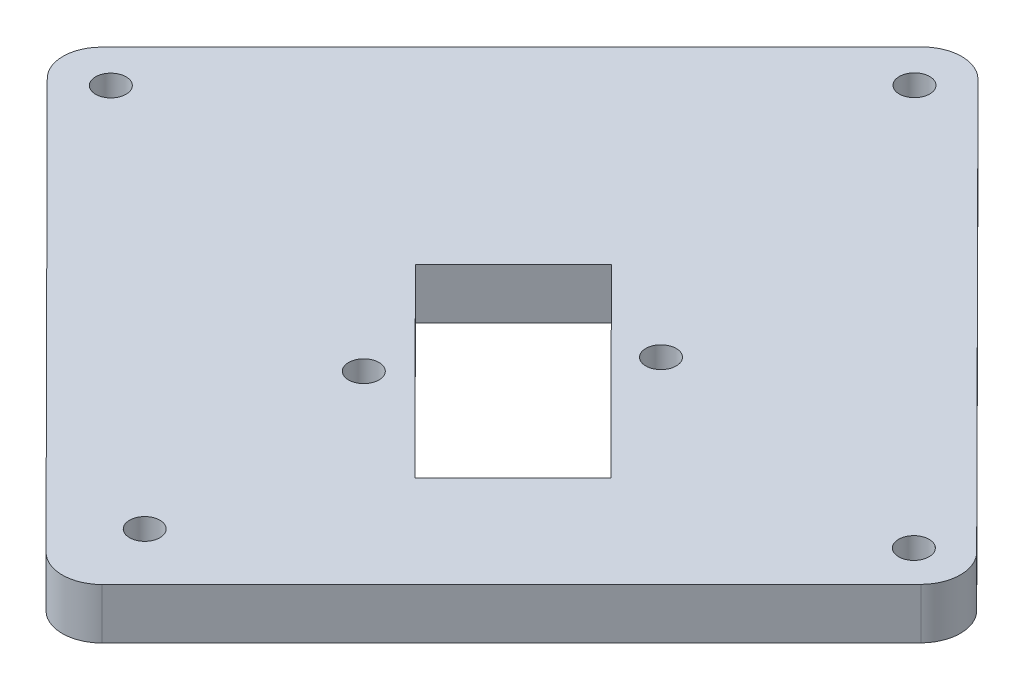
ISO-10303-21;
HEADER;
FILE_DESCRIPTION(('STEP AP214'),'2;1');
FILE_NAME('part.step','',(''),(''),'','','');
FILE_SCHEMA(('AUTOMOTIVE_DESIGN { 1 0 10303 214 1 1 1 1 }'));
ENDSEC;
DATA;
#1=APPLICATION_CONTEXT('core data for automotive mechanical design processes');
#2=APPLICATION_PROTOCOL_DEFINITION('international standard','automotive_design',2000,#1);
#3=PRODUCT_CONTEXT('',#1,'mechanical');
#4=PRODUCT('Part','Part','',(#3));
#5=PRODUCT_RELATED_PRODUCT_CATEGORY('part','',(#4));
#6=PRODUCT_DEFINITION_FORMATION('','',#4);
#7=PRODUCT_DEFINITION_CONTEXT('part definition',#1,'design');
#8=PRODUCT_DEFINITION('design','',#6,#7);
#9=PRODUCT_DEFINITION_SHAPE('','',#8);
#10=(LENGTH_UNIT() NAMED_UNIT(*) SI_UNIT(.MILLI.,.METRE.));
#11=(NAMED_UNIT(*) PLANE_ANGLE_UNIT() SI_UNIT($,.RADIAN.));
#12=(NAMED_UNIT(*) SI_UNIT($,.STERADIAN.) SOLID_ANGLE_UNIT());
#13=UNCERTAINTY_MEASURE_WITH_UNIT(LENGTH_MEASURE(1.E-05),#10,'distance_accuracy_value','');
#14=(GEOMETRIC_REPRESENTATION_CONTEXT(3) GLOBAL_UNCERTAINTY_ASSIGNED_CONTEXT((#13)) GLOBAL_UNIT_ASSIGNED_CONTEXT((#10,
#11,#12)) REPRESENTATION_CONTEXT('',''));
#15=CARTESIAN_POINT('',(0.,0.,0.));
#16=DIRECTION('',(0.,0.,1.));
#17=DIRECTION('',(1.,0.,0.));
#18=AXIS2_PLACEMENT_3D('',#15,#16,#17);
#19=CARTESIAN_POINT('',(-23.1718112798814,3.175,-2.50689147833128));
#20=DIRECTION('',(0.,1.,0.));
#21=DIRECTION('',(0.,0.,1.));
#22=AXIS2_PLACEMENT_3D('',#19,#20,#21);
#23=PLANE('',#22);
#24=CARTESIAN_POINT('',(2.63009312960293,3.175,20.5685466159634));
#25=DIRECTION('',(0.,1.,0.));
#26=DIRECTION('',(0.,0.,1.));
#27=AXIS2_PLACEMENT_3D('',#24,#25,#26);
#28=CIRCLE('',#27,0.9525);
#29=CARTESIAN_POINT('',(2.63009312960293,3.175,21.5210466159634));
#30=VERTEX_POINT('',#29);
#31=EDGE_CURVE('E347',#30,#30,#28,.T.);
#32=ORIENTED_EDGE('',*,*,#31,.F.);
#33=EDGE_LOOP('',(#32));
#34=FACE_BOUND('',#33,.T.);
#35=CARTESIAN_POINT('',(0.935185954294956,3.175,5.154528514304));
#36=DIRECTION('',(0.,1.,0.));
#37=DIRECTION('',(0.,0.,1.));
#38=AXIS2_PLACEMENT_3D('',#35,#36,#37);
#39=CIRCLE('',#38,0.9525);
#40=CARTESIAN_POINT('',(0.935185954294956,3.175,6.107028514304));
#41=VERTEX_POINT('',#40);
#42=EDGE_CURVE('E151',#41,#41,#39,.T.);
#43=ORIENTED_EDGE('',*,*,#42,.F.);
#44=EDGE_LOOP('',(#43));
#45=FACE_BOUND('',#44,.T.);
#46=CARTESIAN_POINT('',(2.6704206595908,3.175,-27.5950826872822));
#47=DIRECTION('',(0.,1.,0.));
#48=DIRECTION('',(0.,0.,1.));
#49=AXIS2_PLACEMENT_3D('',#46,#47,#48);
#50=CIRCLE('',#49,0.9525);
#51=CARTESIAN_POINT('',(2.6704206595908,3.175,-26.6425826872822));
#52=VERTEX_POINT('',#51);
#53=EDGE_CURVE('E167',#52,#52,#50,.T.);
#54=ORIENTED_EDGE('',*,*,#53,.F.);
#55=EDGE_LOOP('',(#54));
#56=FACE_BOUND('',#55,.T.);
#57=CARTESIAN_POINT('',(-23.1718112798814,3.175,-2.50689147833128));
#58=DIRECTION('',(0.,1.,0.));
#59=DIRECTION('',(0.,0.,1.));
#60=AXIS2_PLACEMENT_3D('',#57,#58,#59);
#61=CIRCLE('',#60,2.38946572512477);
#62=CARTESIAN_POINT('',(-24.9169081580778,3.175,-4.13912410184275));
#63=VERTEX_POINT('',#62);
#64=CARTESIAN_POINT('',(-24.8041686582575,3.175,-0.761911294831473));
#65=VERTEX_POINT('',#64);
#66=EDGE_CURVE('E173',#63,#65,#61,.T.);
#67=ORIENTED_EDGE('',*,*,#66,.T.);
#68=DIRECTION('',(0.706027763296106,0.,0.708184155043797));
#69=VECTOR('',#68,1.);
#70=CARTESIAN_POINT('',(-24.8041686582575,3.175,-0.761911294831473));
#71=LINE('',#70,#69);
#72=CARTESIAN_POINT('',(0.802012418444977,3.175,24.9224776944125));
#73=VERTEX_POINT('',#72);
#74=EDGE_CURVE('E176',#65,#73,#71,.T.);
#75=ORIENTED_EDGE('',*,*,#74,.T.);
#76=CARTESIAN_POINT('',(2.55011335151195,3.175,23.1796996570914));
#77=DIRECTION('',(0.,1.,0.));
#78=DIRECTION('',(0.,0.,1.));
#79=AXIS2_PLACEMENT_3D('',#76,#77,#78);
#80=CIRCLE('',#79,2.46842706182668);
#81=CARTESIAN_POINT('',(4.29605739519785,3.175,24.9246384972448));
#82=VERTEX_POINT('',#81);
#83=EDGE_CURVE('E179',#73,#82,#80,.T.);
#84=ORIENTED_EDGE('',*,*,#83,.T.);
#85=DIRECTION('',(0.706903139711224,0.,-0.707310364031529));
#86=VECTOR('',#85,1.);
#87=CARTESIAN_POINT('',(4.29605739519785,3.175,24.9246384972448));
#88=LINE('',#87,#86);
#89=CARTESIAN_POINT('',(29.9338436759336,3.175,-0.727916893296453));
#90=VERTEX_POINT('',#89);
#91=EDGE_CURVE('E181',#82,#90,#88,.T.);
#92=ORIENTED_EDGE('',*,*,#91,.T.);
#93=CARTESIAN_POINT('',(28.1816495488589,3.175,-2.47910221843815));
#94=DIRECTION('',(0.,1.,0.));
#95=DIRECTION('',(0.,0.,1.));
#96=AXIS2_PLACEMENT_3D('',#93,#94,#95);
#97=CIRCLE('',#96,2.47726347043398);
#98=CARTESIAN_POINT('',(30.0224247155794,3.175,-4.136926421281));
#99=VERTEX_POINT('',#98);
#100=EDGE_CURVE('E183',#90,#99,#97,.T.);
#101=ORIENTED_EDGE('',*,*,#100,.T.);
#102=DIRECTION('',(-0.705965314188911,0.,-0.708246408506356));
#103=VECTOR('',#102,1.);
#104=CARTESIAN_POINT('',(30.0224247155794,3.175,-4.136926421281));
#105=LINE('',#104,#103);
#106=CARTESIAN_POINT('',(4.32984241864425,3.175,-29.9125258329386));
#107=VERTEX_POINT('',#106);
#108=EDGE_CURVE('E185',#99,#107,#105,.T.);
#109=ORIENTED_EDGE('',*,*,#108,.T.);
#110=CARTESIAN_POINT('',(2.58188040897351,3.175,-28.1698858229658));
#111=DIRECTION('',(0.,1.,0.));
#112=DIRECTION('',(0.,0.,1.));
#113=AXIS2_PLACEMENT_3D('',#110,#111,#112);
#114=CIRCLE('',#113,2.46823122733875);
#115=CARTESIAN_POINT('',(0.8360798479113,3.175,-29.9146911968127));
#116=VERTEX_POINT('',#115);
#117=EDGE_CURVE('E187',#107,#116,#114,.T.);
#118=ORIENTED_EDGE('',*,*,#117,.T.);
#119=DIRECTION('',(-0.706796869073403,0.,0.70741655753031));
#120=VECTOR('',#119,1.);
#121=CARTESIAN_POINT('',(0.8360798479113,3.175,-29.9146911968127));
#122=LINE('',#121,#120);
#123=EDGE_CURVE('E189',#116,#63,#122,.T.);
#124=ORIENTED_EDGE('',*,*,#123,.T.);
#125=EDGE_LOOP('',(#67,#75,#84,#92,#101,#109,#118,#124));
#126=FACE_BOUND('',#125,.T.);
#127=CARTESIAN_POINT('',(-22.4781493706066,3.175,-2.41749695209192));
#128=DIRECTION('',(0.,1.,0.));
#129=DIRECTION('',(0.,0.,1.));
#130=AXIS2_PLACEMENT_3D('',#127,#128,#129);
#131=CIRCLE('',#130,0.9525);
#132=CARTESIAN_POINT('',(-22.4781493706066,3.175,-1.46499695209192));
#133=VERTEX_POINT('',#132);
#134=EDGE_CURVE('E161',#133,#133,#131,.T.);
#135=ORIENTED_EDGE('',*,*,#134,.F.);
#136=EDGE_LOOP('',(#135));
#137=FACE_BOUND('',#136,.T.);
#138=DIRECTION('',(-0.706027823742744,0.,-0.708184094781212));
#139=VECTOR('',#138,1.);
#140=CARTESIAN_POINT('',(2.89923091873227,3.175,-8.3876728895182));
#141=LINE('',#140,#139);
#142=CARTESIAN_POINT('',(14.4529886915992,3.175,3.20137107524276));
#143=VERTEX_POINT('',#142);
#144=CARTESIAN_POINT('',(2.89923091873227,3.175,-8.3876728895182));
#145=VERTEX_POINT('',#144);
#146=EDGE_CURVE('E130',#143,#145,#141,.T.);
#147=ORIENTED_EDGE('',*,*,#146,.F.);
#148=DIRECTION('',(0.706899868156655,0.,-0.707313633687421));
#149=VECTOR('',#148,1.);
#150=CARTESIAN_POINT('',(14.4529886915992,3.175,3.20137107524276));
#151=LINE('',#150,#149);
#152=CARTESIAN_POINT('',(8.31698867944415,3.175,9.34096263609684));
#153=VERTEX_POINT('',#152);
#154=EDGE_CURVE('E122',#153,#143,#151,.T.);
#155=ORIENTED_EDGE('',*,*,#154,.F.);
#156=DIRECTION('',(0.706027818472181,0.,0.708184100035728));
#157=VECTOR('',#156,1.);
#158=CARTESIAN_POINT('',(8.31698867944415,3.175,9.34096263609684));
#159=LINE('',#158,#157);
#160=CARTESIAN_POINT('',(-3.23663025167331,3.175,-2.24794223537822));
#161=VERTEX_POINT('',#160);
#162=EDGE_CURVE('E145',#161,#153,#159,.T.);
#163=ORIENTED_EDGE('',*,*,#162,.F.);
#164=DIRECTION('',(-0.706883853499556,0.,0.707329638613863));
#165=VECTOR('',#164,1.);
#166=CARTESIAN_POINT('',(-3.23663025167331,3.175,-2.24794223537822));
#167=LINE('',#166,#165);
#168=EDGE_CURVE('E143',#145,#161,#167,.T.);
#169=ORIENTED_EDGE('',*,*,#168,.F.);
#170=EDGE_LOOP('',(#147,#155,#163,#169));
#171=FACE_BOUND('',#170,.T.);
#172=CARTESIAN_POINT('',(9.4803020401967,3.175,-4.90951312977364));
#173=DIRECTION('',(0.,1.,0.));
#174=DIRECTION('',(0.,0.,1.));
#175=AXIS2_PLACEMENT_3D('',#172,#173,#174);
#176=CIRCLE('',#175,0.9525);
#177=CARTESIAN_POINT('',(9.4803020401967,3.175,-3.95701312977364));
#178=VERTEX_POINT('',#177);
#179=EDGE_CURVE('E353',#178,#178,#176,.T.);
#180=ORIENTED_EDGE('',*,*,#179,.F.);
#181=EDGE_LOOP('',(#180));
#182=FACE_BOUND('',#181,.T.);
#183=CARTESIAN_POINT('',(27.7468636700279,3.175,-2.47910221843815));
#184=DIRECTION('',(0.,1.,0.));
#185=DIRECTION('',(0.,0.,1.));
#186=AXIS2_PLACEMENT_3D('',#183,#184,#185);
#187=CIRCLE('',#186,0.9525);
#188=CARTESIAN_POINT('',(27.7468636700279,3.175,-1.52660221843815));
#189=VERTEX_POINT('',#188);
#190=EDGE_CURVE('E338',#189,#189,#187,.T.);
#191=ORIENTED_EDGE('',*,*,#190,.F.);
#192=EDGE_LOOP('',(#191));
#193=FACE_BOUND('',#192,.T.);
#194=ADVANCED_FACE('F33',(#34,#45,#56,#126,#137,#171,#182,#193),#23,.T.);
#195=CARTESIAN_POINT('',(-23.1718112798814,0.,-2.50689147833128));
#196=DIRECTION('',(0.,1.,0.));
#197=DIRECTION('',(0.,0.,1.));
#198=AXIS2_PLACEMENT_3D('',#195,#196,#197);
#199=PLANE('',#198);
#200=CARTESIAN_POINT('',(-22.4781493706066,0.,-2.41749695209192));
#201=DIRECTION('',(0.,1.,0.));
#202=DIRECTION('',(0.,0.,1.));
#203=AXIS2_PLACEMENT_3D('',#200,#201,#202);
#204=CIRCLE('',#203,0.9525);
#205=CARTESIAN_POINT('',(-22.4781493706066,0.,-1.46499695209192));
#206=VERTEX_POINT('',#205);
#207=EDGE_CURVE('E138',#206,#206,#204,.T.);
#208=ORIENTED_EDGE('',*,*,#207,.T.);
#209=EDGE_LOOP('',(#208));
#210=FACE_BOUND('',#209,.T.);
#211=CARTESIAN_POINT('',(2.6704206595908,0.,-27.5950826872822));
#212=DIRECTION('',(0.,1.,0.));
#213=DIRECTION('',(0.,0.,1.));
#214=AXIS2_PLACEMENT_3D('',#211,#212,#213);
#215=CIRCLE('',#214,0.9525);
#216=CARTESIAN_POINT('',(2.6704206595908,0.,-26.6425826872822));
#217=VERTEX_POINT('',#216);
#218=EDGE_CURVE('E164',#217,#217,#215,.T.);
#219=ORIENTED_EDGE('',*,*,#218,.T.);
#220=EDGE_LOOP('',(#219));
#221=FACE_BOUND('',#220,.T.);
#222=CARTESIAN_POINT('',(-23.1718112798814,0.,-2.50689147833128));
#223=DIRECTION('',(0.,1.,0.));
#224=DIRECTION('',(0.,0.,1.));
#225=AXIS2_PLACEMENT_3D('',#222,#223,#224);
#226=CIRCLE('',#225,2.38946572512477);
#227=CARTESIAN_POINT('',(-24.9169081580778,0.,-4.13912410184275));
#228=VERTEX_POINT('',#227);
#229=CARTESIAN_POINT('',(-24.8041686582575,0.,-0.761911294831473));
#230=VERTEX_POINT('',#229);
#231=EDGE_CURVE('E170',#228,#230,#226,.T.);
#232=ORIENTED_EDGE('',*,*,#231,.F.);
#233=DIRECTION('',(-0.706796869073403,0.,0.70741655753031));
#234=VECTOR('',#233,1.);
#235=CARTESIAN_POINT('',(0.8360798479113,0.,-29.9146911968127));
#236=LINE('',#235,#234);
#237=CARTESIAN_POINT('',(0.8360798479113,0.,-29.9146911968127));
#238=VERTEX_POINT('',#237);
#239=EDGE_CURVE('E177',#238,#228,#236,.T.);
#240=ORIENTED_EDGE('',*,*,#239,.F.);
#241=CARTESIAN_POINT('',(2.58188040897351,0.,-28.1698858229658));
#242=DIRECTION('',(0.,1.,0.));
#243=DIRECTION('',(0.,0.,1.));
#244=AXIS2_PLACEMENT_3D('',#241,#242,#243);
#245=CIRCLE('',#244,2.46823122733875);
#246=CARTESIAN_POINT('',(4.32984241864425,0.,-29.9125258329386));
#247=VERTEX_POINT('',#246);
#248=EDGE_CURVE('E204',#247,#238,#245,.T.);
#249=ORIENTED_EDGE('',*,*,#248,.F.);
#250=DIRECTION('',(-0.705965314188911,0.,-0.708246408506356));
#251=VECTOR('',#250,1.);
#252=CARTESIAN_POINT('',(30.0224247155794,0.,-4.136926421281));
#253=LINE('',#252,#251);
#254=CARTESIAN_POINT('',(30.0224247155794,0.,-4.136926421281));
#255=VERTEX_POINT('',#254);
#256=EDGE_CURVE('E202',#255,#247,#253,.T.);
#257=ORIENTED_EDGE('',*,*,#256,.F.);
#258=CARTESIAN_POINT('',(28.1816495488589,0.,-2.47910221843815));
#259=DIRECTION('',(0.,1.,0.));
#260=DIRECTION('',(0.,0.,1.));
#261=AXIS2_PLACEMENT_3D('',#258,#259,#260);
#262=CIRCLE('',#261,2.47726347043398);
#263=CARTESIAN_POINT('',(29.9338436759336,0.,-0.727916893296453));
#264=VERTEX_POINT('',#263);
#265=EDGE_CURVE('E200',#264,#255,#262,.T.);
#266=ORIENTED_EDGE('',*,*,#265,.F.);
#267=DIRECTION('',(0.706903139711224,0.,-0.707310364031529));
#268=VECTOR('',#267,1.);
#269=CARTESIAN_POINT('',(4.29605739519785,0.,24.9246384972448));
#270=LINE('',#269,#268);
#271=CARTESIAN_POINT('',(4.29605739519785,0.,24.9246384972448));
#272=VERTEX_POINT('',#271);
#273=EDGE_CURVE('E198',#272,#264,#270,.T.);
#274=ORIENTED_EDGE('',*,*,#273,.F.);
#275=CARTESIAN_POINT('',(2.55011335151195,0.,23.1796996570914));
#276=DIRECTION('',(0.,1.,0.));
#277=DIRECTION('',(0.,0.,1.));
#278=AXIS2_PLACEMENT_3D('',#275,#276,#277);
#279=CIRCLE('',#278,2.46842706182668);
#280=CARTESIAN_POINT('',(0.802012418444977,0.,24.9224776944125));
#281=VERTEX_POINT('',#280);
#282=EDGE_CURVE('E196',#281,#272,#279,.T.);
#283=ORIENTED_EDGE('',*,*,#282,.F.);
#284=DIRECTION('',(0.706027763296106,0.,0.708184155043797));
#285=VECTOR('',#284,1.);
#286=CARTESIAN_POINT('',(-24.8041686582575,0.,-0.761911294831473));
#287=LINE('',#286,#285);
#288=EDGE_CURVE('E194',#230,#281,#287,.T.);
#289=ORIENTED_EDGE('',*,*,#288,.F.);
#290=EDGE_LOOP('',(#232,#240,#249,#257,#266,#274,#283,#289));
#291=FACE_BOUND('',#290,.T.);
#292=DIRECTION('',(0.706899868156655,0.,-0.707313633687421));
#293=VECTOR('',#292,1.);
#294=CARTESIAN_POINT('',(14.4529886915992,0.,3.20137107524276));
#295=LINE('',#294,#293);
#296=CARTESIAN_POINT('',(8.31698867944415,0.,9.34096263609684));
#297=VERTEX_POINT('',#296);
#298=CARTESIAN_POINT('',(14.4529886915992,0.,3.20137107524276));
#299=VERTEX_POINT('',#298);
#300=EDGE_CURVE('E56',#297,#299,#295,.T.);
#301=ORIENTED_EDGE('',*,*,#300,.T.);
#302=DIRECTION('',(-0.706027823742744,0.,-0.708184094781212));
#303=VECTOR('',#302,1.);
#304=CARTESIAN_POINT('',(2.89923091873227,0.,-8.3876728895182));
#305=LINE('',#304,#303);
#306=CARTESIAN_POINT('',(2.89923091873227,0.,-8.3876728895182));
#307=VERTEX_POINT('',#306);
#308=EDGE_CURVE('E137',#299,#307,#305,.T.);
#309=ORIENTED_EDGE('',*,*,#308,.T.);
#310=DIRECTION('',(-0.706883853499556,0.,0.707329638613863));
#311=VECTOR('',#310,1.);
#312=CARTESIAN_POINT('',(-3.23663025167331,0.,-2.24794223537822));
#313=LINE('',#312,#311);
#314=CARTESIAN_POINT('',(-3.23663025167331,0.,-2.24794223537822));
#315=VERTEX_POINT('',#314);
#316=EDGE_CURVE('E153',#307,#315,#313,.T.);
#317=ORIENTED_EDGE('',*,*,#316,.T.);
#318=DIRECTION('',(0.706027818472181,0.,0.708184100035728));
#319=VECTOR('',#318,1.);
#320=CARTESIAN_POINT('',(8.31698867944415,0.,9.34096263609684));
#321=LINE('',#320,#319);
#322=EDGE_CURVE('E131',#315,#297,#321,.T.);
#323=ORIENTED_EDGE('',*,*,#322,.T.);
#324=EDGE_LOOP('',(#301,#309,#317,#323));
#325=FACE_BOUND('',#324,.T.);
#326=CARTESIAN_POINT('',(0.935185954294956,0.,5.154528514304));
#327=DIRECTION('',(0.,1.,0.));
#328=DIRECTION('',(0.,0.,1.));
#329=AXIS2_PLACEMENT_3D('',#326,#327,#328);
#330=CIRCLE('',#329,0.9525);
#331=CARTESIAN_POINT('',(0.935185954294956,0.,6.107028514304));
#332=VERTEX_POINT('',#331);
#333=EDGE_CURVE('E356',#332,#332,#330,.T.);
#334=ORIENTED_EDGE('',*,*,#333,.T.);
#335=EDGE_LOOP('',(#334));
#336=FACE_BOUND('',#335,.T.);
#337=CARTESIAN_POINT('',(9.4803020401967,0.,-4.90951312977364));
#338=DIRECTION('',(0.,1.,0.));
#339=DIRECTION('',(0.,0.,1.));
#340=AXIS2_PLACEMENT_3D('',#337,#338,#339);
#341=CIRCLE('',#340,0.9525);
#342=CARTESIAN_POINT('',(9.4803020401967,0.,-3.95701312977364));
#343=VERTEX_POINT('',#342);
#344=EDGE_CURVE('E350',#343,#343,#341,.T.);
#345=ORIENTED_EDGE('',*,*,#344,.T.);
#346=EDGE_LOOP('',(#345));
#347=FACE_BOUND('',#346,.T.);
#348=CARTESIAN_POINT('',(2.63009312960293,0.,20.5685466159634));
#349=DIRECTION('',(0.,1.,0.));
#350=DIRECTION('',(0.,0.,1.));
#351=AXIS2_PLACEMENT_3D('',#348,#349,#350);
#352=CIRCLE('',#351,0.9525);
#353=CARTESIAN_POINT('',(2.63009312960293,0.,21.5210466159634));
#354=VERTEX_POINT('',#353);
#355=EDGE_CURVE('E344',#354,#354,#352,.T.);
#356=ORIENTED_EDGE('',*,*,#355,.T.);
#357=EDGE_LOOP('',(#356));
#358=FACE_BOUND('',#357,.T.);
#359=CARTESIAN_POINT('',(27.7468636700279,0.,-2.47910221843815));
#360=DIRECTION('',(0.,1.,0.));
#361=DIRECTION('',(0.,0.,1.));
#362=AXIS2_PLACEMENT_3D('',#359,#360,#361);
#363=CIRCLE('',#362,0.9525);
#364=CARTESIAN_POINT('',(27.7468636700279,0.,-1.52660221843815));
#365=VERTEX_POINT('',#364);
#366=EDGE_CURVE('E341',#365,#365,#363,.T.);
#367=ORIENTED_EDGE('',*,*,#366,.T.);
#368=EDGE_LOOP('',(#367));
#369=FACE_BOUND('',#368,.T.);
#370=ADVANCED_FACE('F234',(#210,#221,#291,#325,#336,#347,#358,#369),#199,.F.);
#371=CARTESIAN_POINT('',(-23.1718112798814,3.175,-2.50689147833128));
#372=DIRECTION('',(0.,-1.,0.));
#373=DIRECTION('',(0.,0.,-1.));
#374=AXIS2_PLACEMENT_3D('',#371,#372,#373);
#375=CYLINDRICAL_SURFACE('',#374,2.38946572512477);
#376=ORIENTED_EDGE('',*,*,#231,.T.);
#377=DIRECTION('',(0.,-1.,0.));
#378=VECTOR('',#377,1.);
#379=CARTESIAN_POINT('',(-24.8041686582575,3.175,-0.761911294831473));
#380=LINE('',#379,#378);
#381=EDGE_CURVE('E11',#65,#230,#380,.T.);
#382=ORIENTED_EDGE('',*,*,#381,.F.);
#383=ORIENTED_EDGE('',*,*,#66,.F.);
#384=DIRECTION('',(0.,-1.,0.));
#385=VECTOR('',#384,1.);
#386=CARTESIAN_POINT('',(-24.9169081580778,3.175,-4.13912410184275));
#387=LINE('',#386,#385);
#388=EDGE_CURVE('E191',#63,#228,#387,.T.);
#389=ORIENTED_EDGE('',*,*,#388,.T.);
#390=EDGE_LOOP('',(#376,#382,#383,#389));
#391=FACE_BOUND('',#390,.T.);
#392=ADVANCED_FACE('F35',(#391),#375,.T.);
#393=CARTESIAN_POINT('',(-24.8041686582575,3.175,-0.761911294831473));
#394=DIRECTION('',(0.708184155043797,0.,-0.706027763296106));
#395=DIRECTION('',(-0.706027763296106,0.,-0.708184155043797));
#396=AXIS2_PLACEMENT_3D('',#393,#394,#395);
#397=PLANE('',#396);
#398=ORIENTED_EDGE('',*,*,#288,.T.);
#399=DIRECTION('',(0.,-1.,0.));
#400=VECTOR('',#399,1.);
#401=CARTESIAN_POINT('',(0.802012418444977,3.175,24.9224776944125));
#402=LINE('',#401,#400);
#403=EDGE_CURVE('E41',#73,#281,#402,.T.);
#404=ORIENTED_EDGE('',*,*,#403,.F.);
#405=ORIENTED_EDGE('',*,*,#74,.F.);
#406=ORIENTED_EDGE('',*,*,#381,.T.);
#407=EDGE_LOOP('',(#398,#404,#405,#406));
#408=FACE_BOUND('',#407,.T.);
#409=ADVANCED_FACE('F252',(#408),#397,.F.);
#410=CARTESIAN_POINT('',(2.55011335151195,3.175,23.1796996570914));
#411=DIRECTION('',(0.,-1.,0.));
#412=DIRECTION('',(0.,0.,-1.));
#413=AXIS2_PLACEMENT_3D('',#410,#411,#412);
#414=CYLINDRICAL_SURFACE('',#413,2.46842706182668);
#415=ORIENTED_EDGE('',*,*,#282,.T.);
#416=DIRECTION('',(0.,-1.,0.));
#417=VECTOR('',#416,1.);
#418=CARTESIAN_POINT('',(4.29605739519785,3.175,24.9246384972448));
#419=LINE('',#418,#417);
#420=EDGE_CURVE('E221',#82,#272,#419,.T.);
#421=ORIENTED_EDGE('',*,*,#420,.F.);
#422=ORIENTED_EDGE('',*,*,#83,.F.);
#423=ORIENTED_EDGE('',*,*,#403,.T.);
#424=EDGE_LOOP('',(#415,#421,#422,#423));
#425=FACE_BOUND('',#424,.T.);
#426=ADVANCED_FACE('F228',(#425),#414,.T.);
#427=CARTESIAN_POINT('',(4.29605739519785,3.175,24.9246384972448));
#428=DIRECTION('',(-0.707310364031529,0.,-0.706903139711224));
#429=DIRECTION('',(-0.706903139711224,0.,0.707310364031529));
#430=AXIS2_PLACEMENT_3D('',#427,#428,#429);
#431=PLANE('',#430);
#432=ORIENTED_EDGE('',*,*,#273,.T.);
#433=DIRECTION('',(0.,-1.,0.));
#434=VECTOR('',#433,1.);
#435=CARTESIAN_POINT('',(29.9338436759336,3.175,-0.727916893296453));
#436=LINE('',#435,#434);
#437=EDGE_CURVE('E218',#90,#264,#436,.T.);
#438=ORIENTED_EDGE('',*,*,#437,.F.);
#439=ORIENTED_EDGE('',*,*,#91,.F.);
#440=ORIENTED_EDGE('',*,*,#420,.T.);
#441=EDGE_LOOP('',(#432,#438,#439,#440));
#442=FACE_BOUND('',#441,.T.);
#443=ADVANCED_FACE('F240',(#442),#431,.F.);
#444=CARTESIAN_POINT('',(28.1816495488589,3.175,-2.47910221843815));
#445=DIRECTION('',(0.,-1.,0.));
#446=DIRECTION('',(0.,0.,-1.));
#447=AXIS2_PLACEMENT_3D('',#444,#445,#446);
#448=CYLINDRICAL_SURFACE('',#447,2.47726347043398);
#449=ORIENTED_EDGE('',*,*,#265,.T.);
#450=DIRECTION('',(0.,-1.,0.));
#451=VECTOR('',#450,1.);
#452=CARTESIAN_POINT('',(30.0224247155794,3.175,-4.136926421281));
#453=LINE('',#452,#451);
#454=EDGE_CURVE('E215',#99,#255,#453,.T.);
#455=ORIENTED_EDGE('',*,*,#454,.F.);
#456=ORIENTED_EDGE('',*,*,#100,.F.);
#457=ORIENTED_EDGE('',*,*,#437,.T.);
#458=EDGE_LOOP('',(#449,#455,#456,#457));
#459=FACE_BOUND('',#458,.T.);
#460=ADVANCED_FACE('F244',(#459),#448,.T.);
#461=CARTESIAN_POINT('',(30.0224247155794,3.175,-4.136926421281));
#462=DIRECTION('',(-0.708246408506356,0.,0.705965314188911));
#463=DIRECTION('',(0.705965314188911,0.,0.708246408506356));
#464=AXIS2_PLACEMENT_3D('',#461,#462,#463);
#465=PLANE('',#464);
#466=ORIENTED_EDGE('',*,*,#256,.T.);
#467=DIRECTION('',(0.,-1.,0.));
#468=VECTOR('',#467,1.);
#469=CARTESIAN_POINT('',(4.32984241864425,3.175,-29.9125258329386));
#470=LINE('',#469,#468);
#471=EDGE_CURVE('E212',#107,#247,#470,.T.);
#472=ORIENTED_EDGE('',*,*,#471,.F.);
#473=ORIENTED_EDGE('',*,*,#108,.F.);
#474=ORIENTED_EDGE('',*,*,#454,.T.);
#475=EDGE_LOOP('',(#466,#472,#473,#474));
#476=FACE_BOUND('',#475,.T.);
#477=ADVANCED_FACE('F265',(#476),#465,.F.);
#478=CARTESIAN_POINT('',(2.58188040897351,3.175,-28.1698858229658));
#479=DIRECTION('',(0.,-1.,0.));
#480=DIRECTION('',(0.,0.,-1.));
#481=AXIS2_PLACEMENT_3D('',#478,#479,#480);
#482=CYLINDRICAL_SURFACE('',#481,2.46823122733875);
#483=ORIENTED_EDGE('',*,*,#248,.T.);
#484=DIRECTION('',(0.,-1.,0.));
#485=VECTOR('',#484,1.);
#486=CARTESIAN_POINT('',(0.8360798479113,3.175,-29.9146911968127));
#487=LINE('',#486,#485);
#488=EDGE_CURVE('E209',#116,#238,#487,.T.);
#489=ORIENTED_EDGE('',*,*,#488,.F.);
#490=ORIENTED_EDGE('',*,*,#117,.F.);
#491=ORIENTED_EDGE('',*,*,#471,.T.);
#492=EDGE_LOOP('',(#483,#489,#490,#491));
#493=FACE_BOUND('',#492,.T.);
#494=ADVANCED_FACE('F263',(#493),#482,.T.);
#495=CARTESIAN_POINT('',(0.8360798479113,3.175,-29.9146911968127));
#496=DIRECTION('',(0.70741655753031,0.,0.706796869073403));
#497=DIRECTION('',(0.706796869073403,0.,-0.70741655753031));
#498=AXIS2_PLACEMENT_3D('',#495,#496,#497);
#499=PLANE('',#498);
#500=ORIENTED_EDGE('',*,*,#239,.T.);
#501=ORIENTED_EDGE('',*,*,#388,.F.);
#502=ORIENTED_EDGE('',*,*,#123,.F.);
#503=ORIENTED_EDGE('',*,*,#488,.T.);
#504=EDGE_LOOP('',(#500,#501,#502,#503));
#505=FACE_BOUND('',#504,.T.);
#506=ADVANCED_FACE('F258',(#505),#499,.F.);
#507=CARTESIAN_POINT('',(2.6704206595908,3.175,-27.5950826872822));
#508=DIRECTION('',(0.,-1.,0.));
#509=DIRECTION('',(0.,0.,-1.));
#510=AXIS2_PLACEMENT_3D('',#507,#508,#509);
#511=CYLINDRICAL_SURFACE('',#510,0.9525);
#512=ORIENTED_EDGE('',*,*,#53,.T.);
#513=EDGE_LOOP('',(#512));
#514=FACE_BOUND('',#513,.T.);
#515=ORIENTED_EDGE('',*,*,#218,.F.);
#516=EDGE_LOOP('',(#515));
#517=FACE_BOUND('',#516,.T.);
#518=ADVANCED_FACE('F285',(#514,#517),#511,.F.);
#519=CARTESIAN_POINT('',(-22.4781493706066,3.175,-2.41749695209192));
#520=DIRECTION('',(0.,-1.,0.));
#521=DIRECTION('',(0.,0.,-1.));
#522=AXIS2_PLACEMENT_3D('',#519,#520,#521);
#523=CYLINDRICAL_SURFACE('',#522,0.9525);
#524=ORIENTED_EDGE('',*,*,#134,.T.);
#525=EDGE_LOOP('',(#524));
#526=FACE_BOUND('',#525,.T.);
#527=ORIENTED_EDGE('',*,*,#207,.F.);
#528=EDGE_LOOP('',(#527));
#529=FACE_BOUND('',#528,.T.);
#530=ADVANCED_FACE('F292',(#526,#529),#523,.F.);
#531=CARTESIAN_POINT('',(14.4529886915992,3.175,3.20137107524276));
#532=DIRECTION('',(-0.707313633687421,0.,-0.706899868156655));
#533=DIRECTION('',(-0.706899868156655,0.,0.707313633687421));
#534=AXIS2_PLACEMENT_3D('',#531,#532,#533);
#535=PLANE('',#534);
#536=ORIENTED_EDGE('',*,*,#300,.F.);
#537=DIRECTION('',(0.,-1.,0.));
#538=VECTOR('',#537,1.);
#539=CARTESIAN_POINT('',(8.31698867944415,3.175,9.34096263609684));
#540=LINE('',#539,#538);
#541=EDGE_CURVE('E126',#153,#297,#540,.T.);
#542=ORIENTED_EDGE('',*,*,#541,.F.);
#543=ORIENTED_EDGE('',*,*,#154,.T.);
#544=DIRECTION('',(0.,-1.,0.));
#545=VECTOR('',#544,1.);
#546=CARTESIAN_POINT('',(14.4529886915992,3.175,3.20137107524276));
#547=LINE('',#546,#545);
#548=EDGE_CURVE('E125',#143,#299,#547,.T.);
#549=ORIENTED_EDGE('',*,*,#548,.T.);
#550=EDGE_LOOP('',(#536,#542,#543,#549));
#551=FACE_BOUND('',#550,.T.);
#552=ADVANCED_FACE('F124',(#551),#535,.T.);
#553=CARTESIAN_POINT('',(2.89923091873227,3.175,-8.3876728895182));
#554=DIRECTION('',(-0.708184094781212,0.,0.706027823742744));
#555=DIRECTION('',(0.706027823742744,0.,0.708184094781212));
#556=AXIS2_PLACEMENT_3D('',#553,#554,#555);
#557=PLANE('',#556);
#558=ORIENTED_EDGE('',*,*,#308,.F.);
#559=ORIENTED_EDGE('',*,*,#548,.F.);
#560=ORIENTED_EDGE('',*,*,#146,.T.);
#561=DIRECTION('',(0.,-1.,0.));
#562=VECTOR('',#561,1.);
#563=CARTESIAN_POINT('',(2.89923091873227,3.175,-8.3876728895182));
#564=LINE('',#563,#562);
#565=EDGE_CURVE('E139',#145,#307,#564,.T.);
#566=ORIENTED_EDGE('',*,*,#565,.T.);
#567=EDGE_LOOP('',(#558,#559,#560,#566));
#568=FACE_BOUND('',#567,.T.);
#569=ADVANCED_FACE('F134',(#568),#557,.T.);
#570=CARTESIAN_POINT('',(-3.23663025167331,3.175,-2.24794223537822));
#571=DIRECTION('',(0.707329638613863,0.,0.706883853499556));
#572=DIRECTION('',(0.706883853499556,0.,-0.707329638613863));
#573=AXIS2_PLACEMENT_3D('',#570,#571,#572);
#574=PLANE('',#573);
#575=ORIENTED_EDGE('',*,*,#316,.F.);
#576=ORIENTED_EDGE('',*,*,#565,.F.);
#577=ORIENTED_EDGE('',*,*,#168,.T.);
#578=DIRECTION('',(0.,-1.,0.));
#579=VECTOR('',#578,1.);
#580=CARTESIAN_POINT('',(-3.23663025167331,3.175,-2.24794223537822));
#581=LINE('',#580,#579);
#582=EDGE_CURVE('E48',#161,#315,#581,.T.);
#583=ORIENTED_EDGE('',*,*,#582,.T.);
#584=EDGE_LOOP('',(#575,#576,#577,#583));
#585=FACE_BOUND('',#584,.T.);
#586=ADVANCED_FACE('F311',(#585),#574,.T.);
#587=CARTESIAN_POINT('',(8.31698867944415,3.175,9.34096263609684));
#588=DIRECTION('',(0.708184100035728,0.,-0.706027818472181));
#589=DIRECTION('',(-0.706027818472181,0.,-0.708184100035728));
#590=AXIS2_PLACEMENT_3D('',#587,#588,#589);
#591=PLANE('',#590);
#592=ORIENTED_EDGE('',*,*,#322,.F.);
#593=ORIENTED_EDGE('',*,*,#582,.F.);
#594=ORIENTED_EDGE('',*,*,#162,.T.);
#595=ORIENTED_EDGE('',*,*,#541,.T.);
#596=EDGE_LOOP('',(#592,#593,#594,#595));
#597=FACE_BOUND('',#596,.T.);
#598=ADVANCED_FACE('F314',(#597),#591,.T.);
#599=CARTESIAN_POINT('',(0.935185954294956,3.175,5.154528514304));
#600=DIRECTION('',(0.,-1.,0.));
#601=DIRECTION('',(0.,0.,-1.));
#602=AXIS2_PLACEMENT_3D('',#599,#600,#601);
#603=CYLINDRICAL_SURFACE('',#602,0.9525);
#604=ORIENTED_EDGE('',*,*,#42,.T.);
#605=EDGE_LOOP('',(#604));
#606=FACE_BOUND('',#605,.T.);
#607=ORIENTED_EDGE('',*,*,#333,.F.);
#608=EDGE_LOOP('',(#607));
#609=FACE_BOUND('',#608,.T.);
#610=ADVANCED_FACE('F318',(#606,#609),#603,.F.);
#611=CARTESIAN_POINT('',(9.4803020401967,3.175,-4.90951312977364));
#612=DIRECTION('',(0.,-1.,0.));
#613=DIRECTION('',(0.,0.,-1.));
#614=AXIS2_PLACEMENT_3D('',#611,#612,#613);
#615=CYLINDRICAL_SURFACE('',#614,0.9525);
#616=ORIENTED_EDGE('',*,*,#179,.T.);
#617=EDGE_LOOP('',(#616));
#618=FACE_BOUND('',#617,.T.);
#619=ORIENTED_EDGE('',*,*,#344,.F.);
#620=EDGE_LOOP('',(#619));
#621=FACE_BOUND('',#620,.T.);
#622=ADVANCED_FACE('F321',(#618,#621),#615,.F.);
#623=CARTESIAN_POINT('',(2.63009312960293,3.175,20.5685466159634));
#624=DIRECTION('',(0.,-1.,0.));
#625=DIRECTION('',(0.,0.,-1.));
#626=AXIS2_PLACEMENT_3D('',#623,#624,#625);
#627=CYLINDRICAL_SURFACE('',#626,0.9525);
#628=ORIENTED_EDGE('',*,*,#31,.T.);
#629=EDGE_LOOP('',(#628));
#630=FACE_BOUND('',#629,.T.);
#631=ORIENTED_EDGE('',*,*,#355,.F.);
#632=EDGE_LOOP('',(#631));
#633=FACE_BOUND('',#632,.T.);
#634=ADVANCED_FACE('F325',(#630,#633),#627,.F.);
#635=CARTESIAN_POINT('',(27.7468636700279,3.175,-2.47910221843815));
#636=DIRECTION('',(0.,-1.,0.));
#637=DIRECTION('',(0.,0.,-1.));
#638=AXIS2_PLACEMENT_3D('',#635,#636,#637);
#639=CYLINDRICAL_SURFACE('',#638,0.9525);
#640=ORIENTED_EDGE('',*,*,#190,.T.);
#641=EDGE_LOOP('',(#640));
#642=FACE_BOUND('',#641,.T.);
#643=ORIENTED_EDGE('',*,*,#366,.F.);
#644=EDGE_LOOP('',(#643));
#645=FACE_BOUND('',#644,.T.);
#646=ADVANCED_FACE('F329',(#642,#645),#639,.F.);
#647=CLOSED_SHELL('',(#194,#370,#392,#409,#426,#443,#460,#477,#494,#506,#518,#530,#552,#569,
#586,#598,#610,#622,#634,#646));
#648=MANIFOLD_SOLID_BREP('B2',#647);
#649=ADVANCED_BREP_SHAPE_REPRESENTATION('',(#18,#648),#14);
#650=SHAPE_DEFINITION_REPRESENTATION(#9,#649);
ENDSEC;
END-ISO-10303-21;
